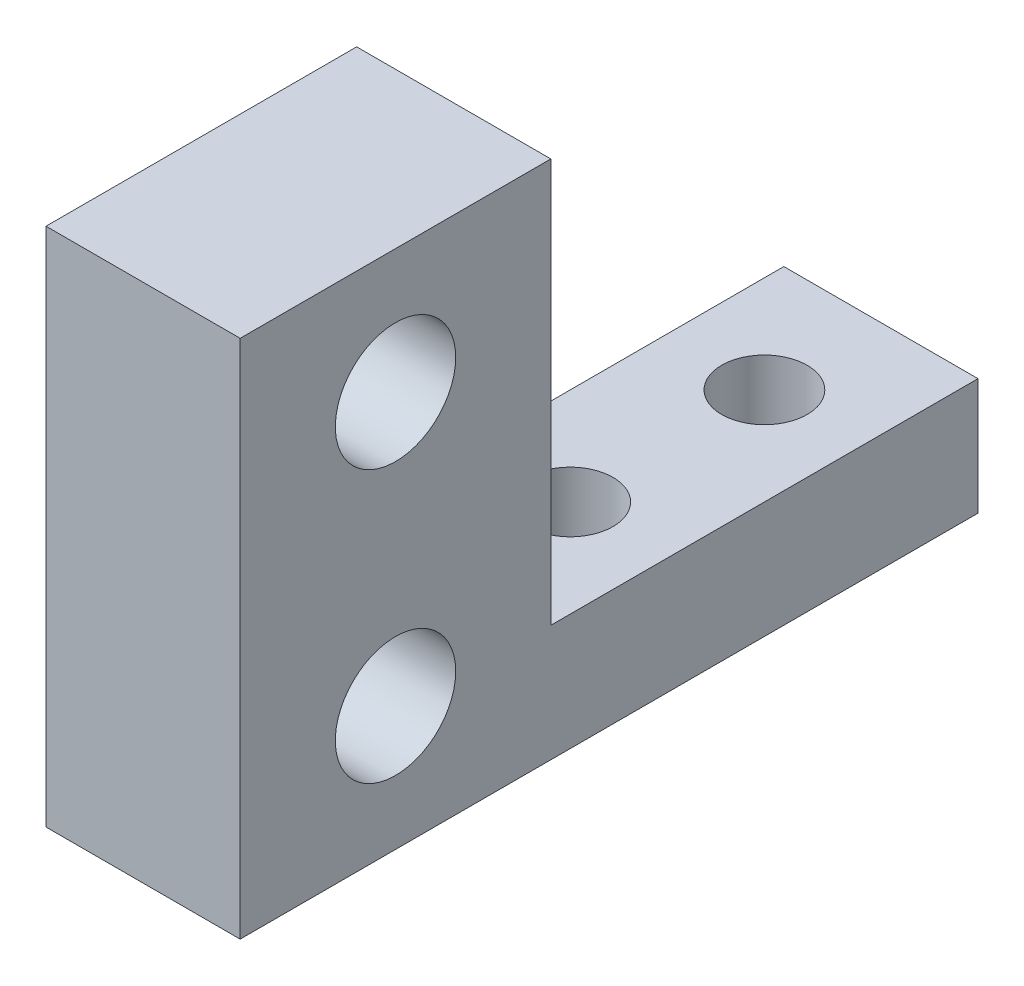
ISO-10303-21;
HEADER;
FILE_DESCRIPTION(('STEP AP214'),'2;1');
FILE_NAME('part.step','',(''),(''),'','','');
FILE_SCHEMA(('AUTOMOTIVE_DESIGN { 1 0 10303 214 1 1 1 1 }'));
ENDSEC;
DATA;
#1=APPLICATION_CONTEXT('core data for automotive mechanical design processes');
#2=APPLICATION_PROTOCOL_DEFINITION('international standard','automotive_design',2000,#1);
#3=PRODUCT_CONTEXT('',#1,'mechanical');
#4=PRODUCT('Part','Part','',(#3));
#5=PRODUCT_RELATED_PRODUCT_CATEGORY('part','',(#4));
#6=PRODUCT_DEFINITION_FORMATION('','',#4);
#7=PRODUCT_DEFINITION_CONTEXT('part definition',#1,'design');
#8=PRODUCT_DEFINITION('design','',#6,#7);
#9=PRODUCT_DEFINITION_SHAPE('','',#8);
#10=(LENGTH_UNIT() NAMED_UNIT(*) SI_UNIT(.MILLI.,.METRE.));
#11=(NAMED_UNIT(*) PLANE_ANGLE_UNIT() SI_UNIT($,.RADIAN.));
#12=(NAMED_UNIT(*) SI_UNIT($,.STERADIAN.) SOLID_ANGLE_UNIT());
#13=UNCERTAINTY_MEASURE_WITH_UNIT(LENGTH_MEASURE(1.E-05),#10,'distance_accuracy_value','');
#14=(GEOMETRIC_REPRESENTATION_CONTEXT(3) GLOBAL_UNCERTAINTY_ASSIGNED_CONTEXT((#13)) GLOBAL_UNIT_ASSIGNED_CONTEXT((#10,
#11,#12)) REPRESENTATION_CONTEXT('',''));
#15=CARTESIAN_POINT('',(0.,0.,0.));
#16=DIRECTION('',(0.,0.,1.));
#17=DIRECTION('',(1.,0.,0.));
#18=AXIS2_PLACEMENT_3D('',#15,#16,#17);
#19=CARTESIAN_POINT('',(5.,0.,0.));
#20=DIRECTION('',(1.,0.,0.));
#21=DIRECTION('',(0.,0.,-1.));
#22=AXIS2_PLACEMENT_3D('',#19,#20,#21);
#23=PLANE('',#22);
#24=CARTESIAN_POINT('',(5.,0.,0.));
#25=DIRECTION('',(1.,0.,0.));
#26=DIRECTION('',(0.,0.,-1.));
#27=AXIS2_PLACEMENT_3D('',#24,#25,#26);
#28=CIRCLE('',#27,1.55);
#29=CARTESIAN_POINT('',(5.,0.,-1.55));
#30=VERTEX_POINT('',#29);
#31=EDGE_CURVE('E125',#30,#30,#28,.T.);
#32=ORIENTED_EDGE('',*,*,#31,.F.);
#33=EDGE_LOOP('',(#32));
#34=FACE_BOUND('',#33,.T.);
#35=DIRECTION('',(0.,1.,0.));
#36=VECTOR('',#35,1.);
#37=CARTESIAN_POINT('',(5.,-3.2,-15.));
#38=LINE('',#37,#36);
#39=CARTESIAN_POINT('',(5.,-3.2,-15.));
#40=VERTEX_POINT('',#39);
#41=CARTESIAN_POINT('',(5.,-0.2,-15.));
#42=VERTEX_POINT('',#41);
#43=EDGE_CURVE('E132',#40,#42,#38,.T.);
#44=ORIENTED_EDGE('',*,*,#43,.T.);
#45=DIRECTION('',(0.,0.,1.));
#46=VECTOR('',#45,1.);
#47=CARTESIAN_POINT('',(5.,-0.2,-15.));
#48=LINE('',#47,#46);
#49=CARTESIAN_POINT('',(5.,-0.200000000000002,-4.));
#50=VERTEX_POINT('',#49);
#51=EDGE_CURVE('E90',#42,#50,#48,.T.);
#52=ORIENTED_EDGE('',*,*,#51,.T.);
#53=DIRECTION('',(0.,1.,0.));
#54=VECTOR('',#53,1.);
#55=CARTESIAN_POINT('',(5.,-0.200000000000002,-4.));
#56=LINE('',#55,#54);
#57=CARTESIAN_POINT('',(5.,10.2,-4.));
#58=VERTEX_POINT('',#57);
#59=EDGE_CURVE('E103',#50,#58,#56,.T.);
#60=ORIENTED_EDGE('',*,*,#59,.T.);
#61=DIRECTION('',(0.,0.,1.));
#62=VECTOR('',#61,1.);
#63=CARTESIAN_POINT('',(5.,10.2,-4.));
#64=LINE('',#63,#62);
#65=CARTESIAN_POINT('',(5.,10.2,4.));
#66=VERTEX_POINT('',#65);
#67=EDGE_CURVE('E97',#58,#66,#64,.T.);
#68=ORIENTED_EDGE('',*,*,#67,.T.);
#69=DIRECTION('',(0.,-1.,0.));
#70=VECTOR('',#69,1.);
#71=CARTESIAN_POINT('',(5.,10.2,4.));
#72=LINE('',#71,#70);
#73=CARTESIAN_POINT('',(5.,-3.2,4.));
#74=VERTEX_POINT('',#73);
#75=EDGE_CURVE('E101',#66,#74,#72,.T.);
#76=ORIENTED_EDGE('',*,*,#75,.T.);
#77=DIRECTION('',(0.,0.,-1.));
#78=VECTOR('',#77,1.);
#79=CARTESIAN_POINT('',(5.,-3.2,4.));
#80=LINE('',#79,#78);
#81=EDGE_CURVE('E53',#74,#40,#80,.T.);
#82=ORIENTED_EDGE('',*,*,#81,.T.);
#83=EDGE_LOOP('',(#44,#52,#60,#68,#76,#82));
#84=FACE_BOUND('',#83,.T.);
#85=CARTESIAN_POINT('',(5.,7.,0.));
#86=DIRECTION('',(1.,0.,0.));
#87=DIRECTION('',(0.,0.,-1.));
#88=AXIS2_PLACEMENT_3D('',#85,#86,#87);
#89=CIRCLE('',#88,1.55);
#90=CARTESIAN_POINT('',(5.,7.,-1.55));
#91=VERTEX_POINT('',#90);
#92=EDGE_CURVE('E152',#91,#91,#89,.T.);
#93=ORIENTED_EDGE('',*,*,#92,.F.);
#94=EDGE_LOOP('',(#93));
#95=FACE_BOUND('',#94,.T.);
#96=ADVANCED_FACE('F34',(#34,#84,#95),#23,.T.);
#97=CARTESIAN_POINT('',(0.,0.,0.));
#98=DIRECTION('',(1.,0.,0.));
#99=DIRECTION('',(0.,0.,-1.));
#100=AXIS2_PLACEMENT_3D('',#97,#98,#99);
#101=PLANE('',#100);
#102=DIRECTION('',(0.,1.,0.));
#103=VECTOR('',#102,1.);
#104=CARTESIAN_POINT('',(0.,-3.2,-15.));
#105=LINE('',#104,#103);
#106=CARTESIAN_POINT('',(0.,-3.2,-15.));
#107=VERTEX_POINT('',#106);
#108=CARTESIAN_POINT('',(0.,-0.2,-15.));
#109=VERTEX_POINT('',#108);
#110=EDGE_CURVE('E121',#107,#109,#105,.T.);
#111=ORIENTED_EDGE('',*,*,#110,.F.);
#112=DIRECTION('',(0.,0.,-1.));
#113=VECTOR('',#112,1.);
#114=CARTESIAN_POINT('',(0.,-3.2,4.));
#115=LINE('',#114,#113);
#116=CARTESIAN_POINT('',(0.,-3.2,4.));
#117=VERTEX_POINT('',#116);
#118=EDGE_CURVE('E82',#117,#107,#115,.T.);
#119=ORIENTED_EDGE('',*,*,#118,.F.);
#120=DIRECTION('',(0.,-1.,0.));
#121=VECTOR('',#120,1.);
#122=CARTESIAN_POINT('',(0.,10.2,4.));
#123=LINE('',#122,#121);
#124=CARTESIAN_POINT('',(0.,10.2,4.));
#125=VERTEX_POINT('',#124);
#126=EDGE_CURVE('E76',#125,#117,#123,.T.);
#127=ORIENTED_EDGE('',*,*,#126,.F.);
#128=DIRECTION('',(0.,0.,1.));
#129=VECTOR('',#128,1.);
#130=CARTESIAN_POINT('',(0.,10.2,-4.));
#131=LINE('',#130,#129);
#132=CARTESIAN_POINT('',(0.,10.2,-4.));
#133=VERTEX_POINT('',#132);
#134=EDGE_CURVE('E111',#133,#125,#131,.T.);
#135=ORIENTED_EDGE('',*,*,#134,.F.);
#136=DIRECTION('',(0.,1.,0.));
#137=VECTOR('',#136,1.);
#138=CARTESIAN_POINT('',(0.,-0.200000000000002,-4.));
#139=LINE('',#138,#137);
#140=CARTESIAN_POINT('',(0.,-0.200000000000002,-4.));
#141=VERTEX_POINT('',#140);
#142=EDGE_CURVE('E127',#141,#133,#139,.T.);
#143=ORIENTED_EDGE('',*,*,#142,.F.);
#144=DIRECTION('',(0.,0.,1.));
#145=VECTOR('',#144,1.);
#146=CARTESIAN_POINT('',(0.,-0.2,-15.));
#147=LINE('',#146,#145);
#148=EDGE_CURVE('E124',#109,#141,#147,.T.);
#149=ORIENTED_EDGE('',*,*,#148,.F.);
#150=EDGE_LOOP('',(#111,#119,#127,#135,#143,#149));
#151=FACE_BOUND('',#150,.T.);
#152=CARTESIAN_POINT('',(0.,0.,0.));
#153=DIRECTION('',(1.,0.,0.));
#154=DIRECTION('',(0.,0.,-1.));
#155=AXIS2_PLACEMENT_3D('',#152,#153,#154);
#156=CIRCLE('',#155,1.55);
#157=CARTESIAN_POINT('',(0.,0.,-1.55));
#158=VERTEX_POINT('',#157);
#159=EDGE_CURVE('E155',#158,#158,#156,.T.);
#160=ORIENTED_EDGE('',*,*,#159,.T.);
#161=EDGE_LOOP('',(#160));
#162=FACE_BOUND('',#161,.T.);
#163=CARTESIAN_POINT('',(0.,7.,0.));
#164=DIRECTION('',(1.,0.,0.));
#165=DIRECTION('',(0.,0.,-1.));
#166=AXIS2_PLACEMENT_3D('',#163,#164,#165);
#167=CIRCLE('',#166,1.55);
#168=CARTESIAN_POINT('',(0.,7.,-1.55));
#169=VERTEX_POINT('',#168);
#170=EDGE_CURVE('E143',#169,#169,#167,.T.);
#171=ORIENTED_EDGE('',*,*,#170,.T.);
#172=EDGE_LOOP('',(#171));
#173=FACE_BOUND('',#172,.T.);
#174=ADVANCED_FACE('F171',(#151,#162,#173),#101,.F.);
#175=CARTESIAN_POINT('',(5.,-3.2,-15.));
#176=DIRECTION('',(0.,0.,1.));
#177=DIRECTION('',(1.,0.,0.));
#178=AXIS2_PLACEMENT_3D('',#175,#176,#177);
#179=PLANE('',#178);
#180=ORIENTED_EDGE('',*,*,#110,.T.);
#181=DIRECTION('',(-1.,0.,0.));
#182=VECTOR('',#181,1.);
#183=CARTESIAN_POINT('',(5.,-0.2,-15.));
#184=LINE('',#183,#182);
#185=EDGE_CURVE('E11',#42,#109,#184,.T.);
#186=ORIENTED_EDGE('',*,*,#185,.F.);
#187=ORIENTED_EDGE('',*,*,#43,.F.);
#188=DIRECTION('',(-1.,0.,0.));
#189=VECTOR('',#188,1.);
#190=CARTESIAN_POINT('',(5.,-3.2,-15.));
#191=LINE('',#190,#189);
#192=EDGE_CURVE('E117',#40,#107,#191,.T.);
#193=ORIENTED_EDGE('',*,*,#192,.T.);
#194=EDGE_LOOP('',(#180,#186,#187,#193));
#195=FACE_BOUND('',#194,.T.);
#196=ADVANCED_FACE('F36',(#195),#179,.F.);
#197=CARTESIAN_POINT('',(5.,-0.2,-15.));
#198=DIRECTION('',(0.,-1.,0.));
#199=DIRECTION('',(0.,0.,-1.));
#200=AXIS2_PLACEMENT_3D('',#197,#198,#199);
#201=PLANE('',#200);
#202=CARTESIAN_POINT('',(2.5,-0.200000000000002,-7.));
#203=DIRECTION('',(0.,1.,0.));
#204=DIRECTION('',(0.,0.,1.));
#205=AXIS2_PLACEMENT_3D('',#202,#203,#204);
#206=CIRCLE('',#205,1.1);
#207=CARTESIAN_POINT('',(2.5,-0.200000000000002,-5.9));
#208=VERTEX_POINT('',#207);
#209=EDGE_CURVE('E139',#208,#208,#206,.T.);
#210=ORIENTED_EDGE('',*,*,#209,.F.);
#211=EDGE_LOOP('',(#210));
#212=FACE_BOUND('',#211,.T.);
#213=CARTESIAN_POINT('',(2.5,-0.200000000000001,-12.));
#214=DIRECTION('',(0.,1.,0.));
#215=DIRECTION('',(0.,0.,1.));
#216=AXIS2_PLACEMENT_3D('',#213,#214,#215);
#217=CIRCLE('',#216,1.1);
#218=CARTESIAN_POINT('',(2.5,-0.200000000000001,-10.9));
#219=VERTEX_POINT('',#218);
#220=EDGE_CURVE('E145',#219,#219,#217,.T.);
#221=ORIENTED_EDGE('',*,*,#220,.F.);
#222=EDGE_LOOP('',(#221));
#223=FACE_BOUND('',#222,.T.);
#224=ORIENTED_EDGE('',*,*,#148,.T.);
#225=DIRECTION('',(-1.,0.,0.));
#226=VECTOR('',#225,1.);
#227=CARTESIAN_POINT('',(5.,-0.200000000000002,-4.));
#228=LINE('',#227,#226);
#229=EDGE_CURVE('E44',#50,#141,#228,.T.);
#230=ORIENTED_EDGE('',*,*,#229,.F.);
#231=ORIENTED_EDGE('',*,*,#51,.F.);
#232=ORIENTED_EDGE('',*,*,#185,.T.);
#233=EDGE_LOOP('',(#224,#230,#231,#232));
#234=FACE_BOUND('',#233,.T.);
#235=ADVANCED_FACE('F165',(#212,#223,#234),#201,.F.);
#236=CARTESIAN_POINT('',(5.,-0.200000000000002,-4.));
#237=DIRECTION('',(0.,0.,1.));
#238=DIRECTION('',(1.,0.,0.));
#239=AXIS2_PLACEMENT_3D('',#236,#237,#238);
#240=PLANE('',#239);
#241=ORIENTED_EDGE('',*,*,#142,.T.);
#242=DIRECTION('',(-1.,0.,0.));
#243=VECTOR('',#242,1.);
#244=CARTESIAN_POINT('',(5.,10.2,-4.));
#245=LINE('',#244,#243);
#246=EDGE_CURVE('E112',#58,#133,#245,.T.);
#247=ORIENTED_EDGE('',*,*,#246,.F.);
#248=ORIENTED_EDGE('',*,*,#59,.F.);
#249=ORIENTED_EDGE('',*,*,#229,.T.);
#250=EDGE_LOOP('',(#241,#247,#248,#249));
#251=FACE_BOUND('',#250,.T.);
#252=ADVANCED_FACE('F168',(#251),#240,.F.);
#253=CARTESIAN_POINT('',(5.,10.2,-4.));
#254=DIRECTION('',(0.,-1.,0.));
#255=DIRECTION('',(0.,0.,-1.));
#256=AXIS2_PLACEMENT_3D('',#253,#254,#255);
#257=PLANE('',#256);
#258=ORIENTED_EDGE('',*,*,#134,.T.);
#259=DIRECTION('',(-1.,0.,0.));
#260=VECTOR('',#259,1.);
#261=CARTESIAN_POINT('',(5.,10.2,4.));
#262=LINE('',#261,#260);
#263=EDGE_CURVE('E108',#66,#125,#262,.T.);
#264=ORIENTED_EDGE('',*,*,#263,.F.);
#265=ORIENTED_EDGE('',*,*,#67,.F.);
#266=ORIENTED_EDGE('',*,*,#246,.T.);
#267=EDGE_LOOP('',(#258,#264,#265,#266));
#268=FACE_BOUND('',#267,.T.);
#269=ADVANCED_FACE('F109',(#268),#257,.F.);
#270=CARTESIAN_POINT('',(5.,10.2,4.));
#271=DIRECTION('',(0.,0.,-1.));
#272=DIRECTION('',(0.,1.,0.));
#273=AXIS2_PLACEMENT_3D('',#270,#271,#272);
#274=PLANE('',#273);
#275=ORIENTED_EDGE('',*,*,#126,.T.);
#276=DIRECTION('',(-1.,0.,0.));
#277=VECTOR('',#276,1.);
#278=CARTESIAN_POINT('',(5.,-3.2,4.));
#279=LINE('',#278,#277);
#280=EDGE_CURVE('E113',#74,#117,#279,.T.);
#281=ORIENTED_EDGE('',*,*,#280,.F.);
#282=ORIENTED_EDGE('',*,*,#75,.F.);
#283=ORIENTED_EDGE('',*,*,#263,.T.);
#284=EDGE_LOOP('',(#275,#281,#282,#283));
#285=FACE_BOUND('',#284,.T.);
#286=ADVANCED_FACE('F115',(#285),#274,.F.);
#287=CARTESIAN_POINT('',(5.,-3.2,4.));
#288=DIRECTION('',(0.,1.,0.));
#289=DIRECTION('',(0.,0.,1.));
#290=AXIS2_PLACEMENT_3D('',#287,#288,#289);
#291=PLANE('',#290);
#292=CARTESIAN_POINT('',(2.5,-3.2,-7.));
#293=DIRECTION('',(0.,1.,0.));
#294=DIRECTION('',(0.,0.,1.));
#295=AXIS2_PLACEMENT_3D('',#292,#293,#294);
#296=CIRCLE('',#295,1.1);
#297=CARTESIAN_POINT('',(2.5,-3.2,-5.9));
#298=VERTEX_POINT('',#297);
#299=EDGE_CURVE('E38',#298,#298,#296,.T.);
#300=ORIENTED_EDGE('',*,*,#299,.T.);
#301=EDGE_LOOP('',(#300));
#302=FACE_BOUND('',#301,.T.);
#303=CARTESIAN_POINT('',(2.5,-3.2,-12.));
#304=DIRECTION('',(0.,1.,0.));
#305=DIRECTION('',(0.,0.,1.));
#306=AXIS2_PLACEMENT_3D('',#303,#304,#305);
#307=CIRCLE('',#306,1.1);
#308=CARTESIAN_POINT('',(2.5,-3.2,-10.9));
#309=VERTEX_POINT('',#308);
#310=EDGE_CURVE('E137',#309,#309,#307,.T.);
#311=ORIENTED_EDGE('',*,*,#310,.T.);
#312=EDGE_LOOP('',(#311));
#313=FACE_BOUND('',#312,.T.);
#314=ORIENTED_EDGE('',*,*,#118,.T.);
#315=ORIENTED_EDGE('',*,*,#192,.F.);
#316=ORIENTED_EDGE('',*,*,#81,.F.);
#317=ORIENTED_EDGE('',*,*,#280,.T.);
#318=EDGE_LOOP('',(#314,#315,#316,#317));
#319=FACE_BOUND('',#318,.T.);
#320=ADVANCED_FACE('F174',(#302,#313,#319),#291,.F.);
#321=CARTESIAN_POINT('',(5.,0.,0.));
#322=DIRECTION('',(-1.,0.,0.));
#323=DIRECTION('',(0.,0.,1.));
#324=AXIS2_PLACEMENT_3D('',#321,#322,#323);
#325=CYLINDRICAL_SURFACE('',#324,1.55);
#326=ORIENTED_EDGE('',*,*,#31,.T.);
#327=EDGE_LOOP('',(#326));
#328=FACE_BOUND('',#327,.T.);
#329=ORIENTED_EDGE('',*,*,#159,.F.);
#330=EDGE_LOOP('',(#329));
#331=FACE_BOUND('',#330,.T.);
#332=ADVANCED_FACE('F176',(#328,#331),#325,.F.);
#333=CARTESIAN_POINT('',(5.,7.,0.));
#334=DIRECTION('',(-1.,0.,0.));
#335=DIRECTION('',(0.,0.,1.));
#336=AXIS2_PLACEMENT_3D('',#333,#334,#335);
#337=CYLINDRICAL_SURFACE('',#336,1.55);
#338=ORIENTED_EDGE('',*,*,#92,.T.);
#339=EDGE_LOOP('',(#338));
#340=FACE_BOUND('',#339,.T.);
#341=ORIENTED_EDGE('',*,*,#170,.F.);
#342=EDGE_LOOP('',(#341));
#343=FACE_BOUND('',#342,.T.);
#344=ADVANCED_FACE('F183',(#340,#343),#337,.F.);
#345=CARTESIAN_POINT('',(2.5,-5.2,-12.));
#346=DIRECTION('',(0.,1.,0.));
#347=DIRECTION('',(0.,0.,1.));
#348=AXIS2_PLACEMENT_3D('',#345,#346,#347);
#349=CYLINDRICAL_SURFACE('',#348,1.1);
#350=ORIENTED_EDGE('',*,*,#220,.T.);
#351=EDGE_LOOP('',(#350));
#352=FACE_BOUND('',#351,.T.);
#353=ORIENTED_EDGE('',*,*,#310,.F.);
#354=EDGE_LOOP('',(#353));
#355=FACE_BOUND('',#354,.T.);
#356=ADVANCED_FACE('F198',(#352,#355),#349,.F.);
#357=CARTESIAN_POINT('',(2.5,-5.2,-7.));
#358=DIRECTION('',(0.,1.,0.));
#359=DIRECTION('',(0.,0.,1.));
#360=AXIS2_PLACEMENT_3D('',#357,#358,#359);
#361=CYLINDRICAL_SURFACE('',#360,1.1);
#362=ORIENTED_EDGE('',*,*,#209,.T.);
#363=EDGE_LOOP('',(#362));
#364=FACE_BOUND('',#363,.T.);
#365=ORIENTED_EDGE('',*,*,#299,.F.);
#366=EDGE_LOOP('',(#365));
#367=FACE_BOUND('',#366,.T.);
#368=ADVANCED_FACE('F202',(#364,#367),#361,.F.);
#369=CLOSED_SHELL('',(#96,#174,#196,#235,#252,#269,#286,#320,#332,#344,#356,#368));
#370=MANIFOLD_SOLID_BREP('B2',#369);
#371=ADVANCED_BREP_SHAPE_REPRESENTATION('',(#18,#370),#14);
#372=SHAPE_DEFINITION_REPRESENTATION(#9,#371);
ENDSEC;
END-ISO-10303-21;
